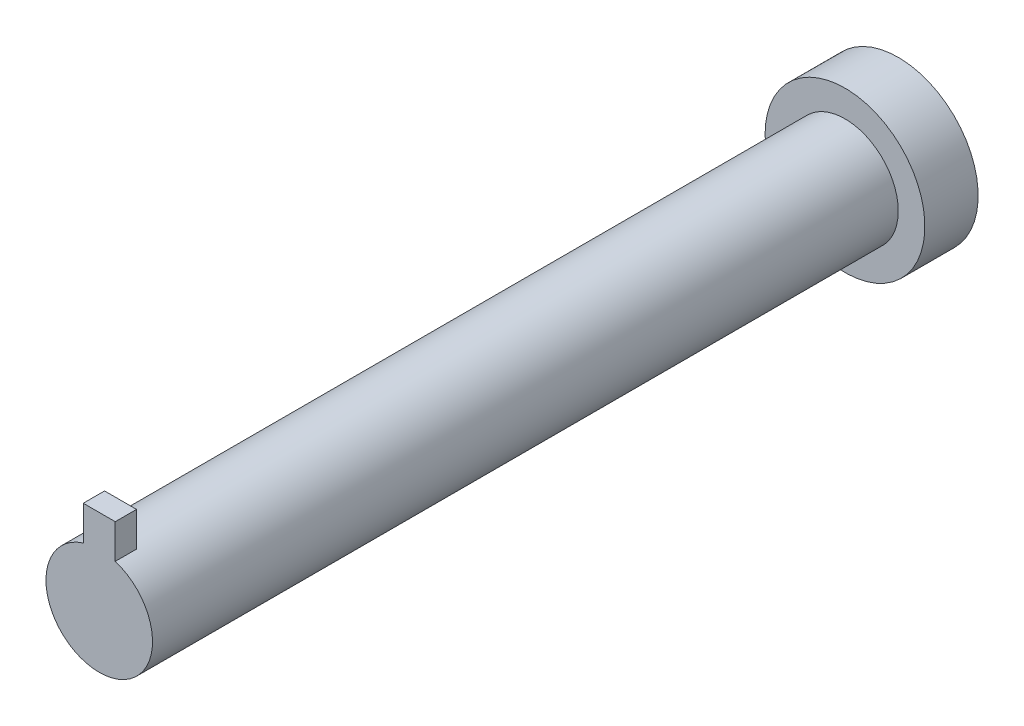
ISO-10303-21;
HEADER;
FILE_DESCRIPTION(('STEP AP214'),'2;1');
FILE_NAME('part.step','',(''),(''),'','','');
FILE_SCHEMA(('AUTOMOTIVE_DESIGN { 1 0 10303 214 1 1 1 1 }'));
ENDSEC;
DATA;
#1=APPLICATION_CONTEXT('core data for automotive mechanical design processes');
#2=APPLICATION_PROTOCOL_DEFINITION('international standard','automotive_design',2000,#1);
#3=PRODUCT_CONTEXT('',#1,'mechanical');
#4=PRODUCT('Part','Part','',(#3));
#5=PRODUCT_RELATED_PRODUCT_CATEGORY('part','',(#4));
#6=PRODUCT_DEFINITION_FORMATION('','',#4);
#7=PRODUCT_DEFINITION_CONTEXT('part definition',#1,'design');
#8=PRODUCT_DEFINITION('design','',#6,#7);
#9=PRODUCT_DEFINITION_SHAPE('','',#8);
#10=(LENGTH_UNIT() NAMED_UNIT(*) SI_UNIT(.MILLI.,.METRE.));
#11=(NAMED_UNIT(*) PLANE_ANGLE_UNIT() SI_UNIT($,.RADIAN.));
#12=(NAMED_UNIT(*) SI_UNIT($,.STERADIAN.) SOLID_ANGLE_UNIT());
#13=UNCERTAINTY_MEASURE_WITH_UNIT(LENGTH_MEASURE(1.E-05),#10,'distance_accuracy_value','');
#14=(GEOMETRIC_REPRESENTATION_CONTEXT(3) GLOBAL_UNCERTAINTY_ASSIGNED_CONTEXT((#13)) GLOBAL_UNIT_ASSIGNED_CONTEXT((#10,
#11,#12)) REPRESENTATION_CONTEXT('',''));
#15=CARTESIAN_POINT('',(0.,0.,0.));
#16=DIRECTION('',(0.,0.,1.));
#17=DIRECTION('',(1.,0.,0.));
#18=AXIS2_PLACEMENT_3D('',#15,#16,#17);
#19=CARTESIAN_POINT('',(0.,0.,70.));
#20=DIRECTION('',(0.,0.,-1.));
#21=DIRECTION('',(-1.,0.,0.));
#22=AXIS2_PLACEMENT_3D('',#19,#20,#21);
#23=CYLINDRICAL_SURFACE('',#22,5.);
#24=CARTESIAN_POINT('',(0.,0.,0.));
#25=DIRECTION('',(0.,0.,1.));
#26=DIRECTION('',(1.,0.,0.));
#27=AXIS2_PLACEMENT_3D('',#24,#25,#26);
#28=CIRCLE('',#27,5.);
#29=CARTESIAN_POINT('',(5.,0.,0.));
#30=VERTEX_POINT('',#29);
#31=EDGE_CURVE('E103',#30,#30,#28,.T.);
#32=ORIENTED_EDGE('',*,*,#31,.T.);
#33=EDGE_LOOP('',(#32));
#34=FACE_BOUND('',#33,.T.);
#35=DIRECTION('',(0.,0.,-1.));
#36=VECTOR('',#35,1.);
#37=CARTESIAN_POINT('',(-1.49999999999999,4.76969600708473,70.));
#38=LINE('',#37,#36);
#39=CARTESIAN_POINT('',(-1.49999999999999,4.76969600708473,68.));
#40=VERTEX_POINT('',#39);
#41=CARTESIAN_POINT('',(-1.49999999999999,4.76969600708473,70.));
#42=VERTEX_POINT('',#41);
#43=EDGE_CURVE('E90',#40,#42,#38,.F.);
#44=ORIENTED_EDGE('',*,*,#43,.F.);
#45=CARTESIAN_POINT('',(0.,0.,68.));
#46=DIRECTION('',(0.,0.,1.));
#47=DIRECTION('',(1.,0.,0.));
#48=AXIS2_PLACEMENT_3D('',#45,#46,#47);
#49=CIRCLE('',#48,5.);
#50=CARTESIAN_POINT('',(1.50000000000001,4.76969600708473,68.));
#51=VERTEX_POINT('',#50);
#52=EDGE_CURVE('E11',#51,#40,#49,.T.);
#53=ORIENTED_EDGE('',*,*,#52,.F.);
#54=DIRECTION('',(0.,0.,-1.));
#55=VECTOR('',#54,1.);
#56=CARTESIAN_POINT('',(1.50000000000001,4.76969600708473,70.));
#57=LINE('',#56,#55);
#58=CARTESIAN_POINT('',(1.50000000000001,4.76969600708473,70.));
#59=VERTEX_POINT('',#58);
#60=EDGE_CURVE('E91',#59,#51,#57,.T.);
#61=ORIENTED_EDGE('',*,*,#60,.F.);
#62=CARTESIAN_POINT('',(0.,0.,70.));
#63=DIRECTION('',(0.,0.,1.));
#64=DIRECTION('',(1.,0.,0.));
#65=AXIS2_PLACEMENT_3D('',#62,#63,#64);
#66=CIRCLE('',#65,5.);
#67=EDGE_CURVE('E40',#42,#59,#66,.T.);
#68=ORIENTED_EDGE('',*,*,#67,.F.);
#69=EDGE_LOOP('',(#44,#53,#61,#68));
#70=FACE_BOUND('',#69,.T.);
#71=ADVANCED_FACE('F33',(#34,#70),#23,.T.);
#72=CARTESIAN_POINT('',(0.,0.,70.));
#73=DIRECTION('',(0.,0.,1.));
#74=DIRECTION('',(1.,0.,0.));
#75=AXIS2_PLACEMENT_3D('',#72,#73,#74);
#76=PLANE('',#75);
#77=ORIENTED_EDGE('',*,*,#67,.T.);
#78=DIRECTION('',(0.,-1.,0.));
#79=VECTOR('',#78,1.);
#80=CARTESIAN_POINT('',(1.50000000000001,8.,70.));
#81=LINE('',#80,#79);
#82=CARTESIAN_POINT('',(1.50000000000001,8.,70.));
#83=VERTEX_POINT('',#82);
#84=EDGE_CURVE('E75',#83,#59,#81,.T.);
#85=ORIENTED_EDGE('',*,*,#84,.F.);
#86=DIRECTION('',(1.,0.,0.));
#87=VECTOR('',#86,1.);
#88=CARTESIAN_POINT('',(-1.49999999999999,8.,70.));
#89=LINE('',#88,#87);
#90=CARTESIAN_POINT('',(-1.49999999999999,8.,70.));
#91=VERTEX_POINT('',#90);
#92=EDGE_CURVE('E69',#91,#83,#89,.T.);
#93=ORIENTED_EDGE('',*,*,#92,.F.);
#94=DIRECTION('',(0.,-1.,0.));
#95=VECTOR('',#94,1.);
#96=CARTESIAN_POINT('',(-1.49999999999999,8.,70.));
#97=LINE('',#96,#95);
#98=EDGE_CURVE('E73',#91,#42,#97,.T.);
#99=ORIENTED_EDGE('',*,*,#98,.T.);
#100=EDGE_LOOP('',(#77,#85,#93,#99));
#101=FACE_BOUND('',#100,.T.);
#102=ADVANCED_FACE('F71',(#101),#76,.T.);
#103=CARTESIAN_POINT('',(0.,0.,-5.));
#104=DIRECTION('',(0.,0.,1.));
#105=DIRECTION('',(1.,0.,0.));
#106=AXIS2_PLACEMENT_3D('',#103,#104,#105);
#107=CYLINDRICAL_SURFACE('',#106,7.5);
#108=CARTESIAN_POINT('',(0.,0.,-5.));
#109=DIRECTION('',(0.,0.,-1.));
#110=DIRECTION('',(-1.,0.,0.));
#111=AXIS2_PLACEMENT_3D('',#108,#109,#110);
#112=CIRCLE('',#111,7.5);
#113=CARTESIAN_POINT('',(-7.5,0.,-5.));
#114=VERTEX_POINT('',#113);
#115=EDGE_CURVE('E100',#114,#114,#112,.T.);
#116=ORIENTED_EDGE('',*,*,#115,.F.);
#117=EDGE_LOOP('',(#116));
#118=FACE_BOUND('',#117,.T.);
#119=CARTESIAN_POINT('',(0.,0.,0.));
#120=DIRECTION('',(0.,0.,-1.));
#121=DIRECTION('',(-1.,0.,0.));
#122=AXIS2_PLACEMENT_3D('',#119,#120,#121);
#123=CIRCLE('',#122,7.5);
#124=CARTESIAN_POINT('',(-7.5,0.,0.));
#125=VERTEX_POINT('',#124);
#126=EDGE_CURVE('E99',#125,#125,#123,.T.);
#127=ORIENTED_EDGE('',*,*,#126,.T.);
#128=EDGE_LOOP('',(#127));
#129=FACE_BOUND('',#128,.T.);
#130=ADVANCED_FACE('F117',(#118,#129),#107,.T.);
#131=CARTESIAN_POINT('',(0.,0.,-5.));
#132=DIRECTION('',(0.,0.,-1.));
#133=DIRECTION('',(-1.,0.,0.));
#134=AXIS2_PLACEMENT_3D('',#131,#132,#133);
#135=PLANE('',#134);
#136=ORIENTED_EDGE('',*,*,#115,.T.);
#137=EDGE_LOOP('',(#136));
#138=FACE_BOUND('',#137,.T.);
#139=ADVANCED_FACE('F113',(#138),#135,.T.);
#140=CARTESIAN_POINT('',(0.,0.,0.));
#141=DIRECTION('',(0.,0.,-1.));
#142=DIRECTION('',(-1.,0.,0.));
#143=AXIS2_PLACEMENT_3D('',#140,#141,#142);
#144=PLANE('',#143);
#145=ORIENTED_EDGE('',*,*,#31,.F.);
#146=EDGE_LOOP('',(#145));
#147=FACE_BOUND('',#146,.T.);
#148=ORIENTED_EDGE('',*,*,#126,.F.);
#149=EDGE_LOOP('',(#148));
#150=FACE_BOUND('',#149,.T.);
#151=ADVANCED_FACE('F110',(#147,#150),#144,.F.);
#152=CARTESIAN_POINT('',(-1.49999999999999,8.,68.));
#153=DIRECTION('',(1.,0.,0.));
#154=DIRECTION('',(0.,0.,-1.));
#155=AXIS2_PLACEMENT_3D('',#152,#153,#154);
#156=PLANE('',#155);
#157=DIRECTION('',(0.,-1.,0.));
#158=VECTOR('',#157,1.);
#159=CARTESIAN_POINT('',(-1.49999999999999,8.,68.));
#160=LINE('',#159,#158);
#161=CARTESIAN_POINT('',(-1.49999999999999,8.,68.));
#162=VERTEX_POINT('',#161);
#163=EDGE_CURVE('E179',#162,#40,#160,.T.);
#164=ORIENTED_EDGE('',*,*,#163,.T.);
#165=ORIENTED_EDGE('',*,*,#43,.T.);
#166=ORIENTED_EDGE('',*,*,#98,.F.);
#167=DIRECTION('',(0.,0.,1.));
#168=VECTOR('',#167,1.);
#169=CARTESIAN_POINT('',(-1.49999999999999,8.,68.));
#170=LINE('',#169,#168);
#171=EDGE_CURVE('E79',#162,#91,#170,.T.);
#172=ORIENTED_EDGE('',*,*,#171,.F.);
#173=EDGE_LOOP('',(#164,#165,#166,#172));
#174=FACE_BOUND('',#173,.T.);
#175=ADVANCED_FACE('F89',(#174),#156,.F.);
#176=CARTESIAN_POINT('',(1.50000000000001,8.,68.));
#177=DIRECTION('',(-1.,0.,0.));
#178=DIRECTION('',(0.,0.,1.));
#179=AXIS2_PLACEMENT_3D('',#176,#177,#178);
#180=PLANE('',#179);
#181=ORIENTED_EDGE('',*,*,#84,.T.);
#182=ORIENTED_EDGE('',*,*,#60,.T.);
#183=DIRECTION('',(0.,-1.,0.));
#184=VECTOR('',#183,1.);
#185=CARTESIAN_POINT('',(1.50000000000001,8.,68.));
#186=LINE('',#185,#184);
#187=CARTESIAN_POINT('',(1.50000000000001,8.,68.));
#188=VERTEX_POINT('',#187);
#189=EDGE_CURVE('E94',#188,#51,#186,.T.);
#190=ORIENTED_EDGE('',*,*,#189,.F.);
#191=DIRECTION('',(0.,0.,-1.));
#192=VECTOR('',#191,1.);
#193=CARTESIAN_POINT('',(1.50000000000001,8.,68.));
#194=LINE('',#193,#192);
#195=EDGE_CURVE('E78',#83,#188,#194,.T.);
#196=ORIENTED_EDGE('',*,*,#195,.F.);
#197=EDGE_LOOP('',(#181,#182,#190,#196));
#198=FACE_BOUND('',#197,.T.);
#199=ADVANCED_FACE('F146',(#198),#180,.F.);
#200=CARTESIAN_POINT('',(-1.49999999999999,8.,68.));
#201=DIRECTION('',(0.,0.,1.));
#202=DIRECTION('',(1.,0.,0.));
#203=AXIS2_PLACEMENT_3D('',#200,#201,#202);
#204=PLANE('',#203);
#205=ORIENTED_EDGE('',*,*,#189,.T.);
#206=ORIENTED_EDGE('',*,*,#52,.T.);
#207=ORIENTED_EDGE('',*,*,#163,.F.);
#208=DIRECTION('',(-1.,0.,0.));
#209=VECTOR('',#208,1.);
#210=CARTESIAN_POINT('',(-1.49999999999999,8.,68.));
#211=LINE('',#210,#209);
#212=EDGE_CURVE('E84',#188,#162,#211,.T.);
#213=ORIENTED_EDGE('',*,*,#212,.F.);
#214=EDGE_LOOP('',(#205,#206,#207,#213));
#215=FACE_BOUND('',#214,.T.);
#216=ADVANCED_FACE('F155',(#215),#204,.F.);
#217=CARTESIAN_POINT('',(0.,8.,0.));
#218=DIRECTION('',(0.,1.,0.));
#219=DIRECTION('',(0.,0.,1.));
#220=AXIS2_PLACEMENT_3D('',#217,#218,#219);
#221=PLANE('',#220);
#222=ORIENTED_EDGE('',*,*,#171,.T.);
#223=ORIENTED_EDGE('',*,*,#92,.T.);
#224=ORIENTED_EDGE('',*,*,#195,.T.);
#225=ORIENTED_EDGE('',*,*,#212,.T.);
#226=EDGE_LOOP('',(#222,#223,#224,#225));
#227=FACE_BOUND('',#226,.T.);
#228=ADVANCED_FACE('F82',(#227),#221,.T.);
#229=CLOSED_SHELL('',(#71,#102,#130,#139,#151,#175,#199,#216,#228));
#230=MANIFOLD_SOLID_BREP('B2',#229);
#231=ADVANCED_BREP_SHAPE_REPRESENTATION('',(#18,#230),#14);
#232=SHAPE_DEFINITION_REPRESENTATION(#9,#231);
ENDSEC;
END-ISO-10303-21;
